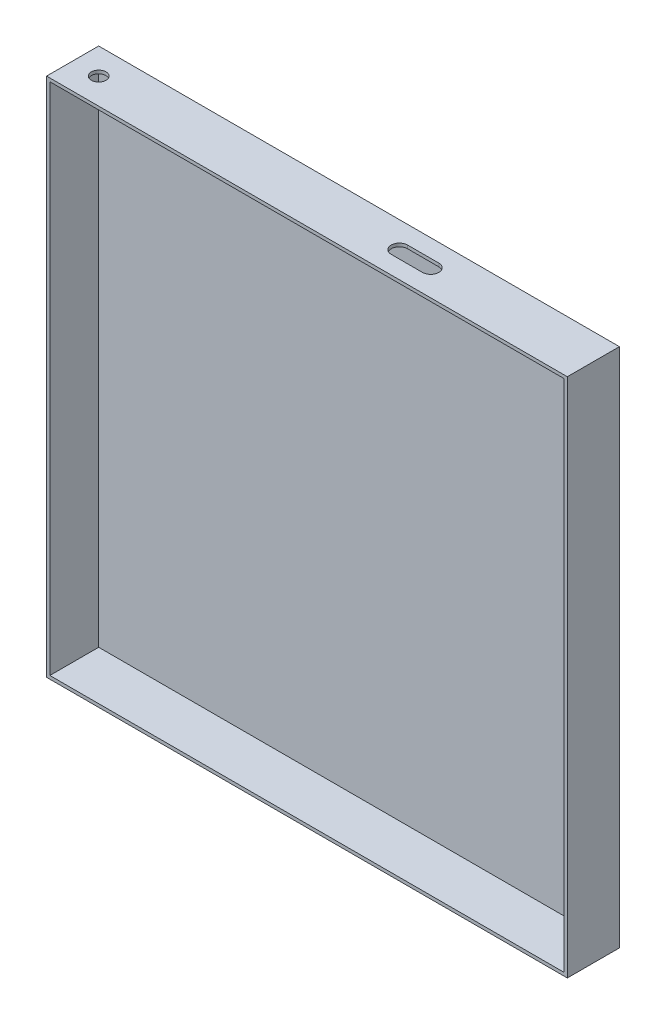
ISO-10303-21;
HEADER;
FILE_DESCRIPTION(('STEP AP214'),'2;1');
FILE_NAME('part.step','',(''),(''),'','','');
FILE_SCHEMA(('AUTOMOTIVE_DESIGN { 1 0 10303 214 1 1 1 1 }'));
ENDSEC;
DATA;
#1=APPLICATION_CONTEXT('core data for automotive mechanical design processes');
#2=APPLICATION_PROTOCOL_DEFINITION('international standard','automotive_design',2000,#1);
#3=PRODUCT_CONTEXT('',#1,'mechanical');
#4=PRODUCT('Part','Part','',(#3));
#5=PRODUCT_RELATED_PRODUCT_CATEGORY('part','',(#4));
#6=PRODUCT_DEFINITION_FORMATION('','',#4);
#7=PRODUCT_DEFINITION_CONTEXT('part definition',#1,'design');
#8=PRODUCT_DEFINITION('design','',#6,#7);
#9=PRODUCT_DEFINITION_SHAPE('','',#8);
#10=(LENGTH_UNIT() NAMED_UNIT(*) SI_UNIT(.MILLI.,.METRE.));
#11=(NAMED_UNIT(*) PLANE_ANGLE_UNIT() SI_UNIT($,.RADIAN.));
#12=(NAMED_UNIT(*) SI_UNIT($,.STERADIAN.) SOLID_ANGLE_UNIT());
#13=UNCERTAINTY_MEASURE_WITH_UNIT(LENGTH_MEASURE(1.E-05),#10,'distance_accuracy_value','');
#14=(GEOMETRIC_REPRESENTATION_CONTEXT(3) GLOBAL_UNCERTAINTY_ASSIGNED_CONTEXT((#13)) GLOBAL_UNIT_ASSIGNED_CONTEXT((#10,
#11,#12)) REPRESENTATION_CONTEXT('',''));
#15=CARTESIAN_POINT('',(0.,0.,0.));
#16=DIRECTION('',(0.,0.,1.));
#17=DIRECTION('',(1.,0.,0.));
#18=AXIS2_PLACEMENT_3D('',#15,#16,#17);
#19=CARTESIAN_POINT('',(0.,0.,50.8));
#20=DIRECTION('',(0.,0.,-1.));
#21=DIRECTION('',(-1.,0.,0.));
#22=AXIS2_PLACEMENT_3D('',#19,#20,#21);
#23=PLANE('',#22);
#24=DIRECTION('',(0.,-1.,0.));
#25=VECTOR('',#24,1.);
#26=CARTESIAN_POINT('',(0.,0.,50.8));
#27=LINE('',#26,#25);
#28=CARTESIAN_POINT('',(0.,508.,50.8));
#29=VERTEX_POINT('',#28);
#30=CARTESIAN_POINT('',(0.,0.,50.8));
#31=VERTEX_POINT('',#30);
#32=EDGE_CURVE('E184',#29,#31,#27,.T.);
#33=ORIENTED_EDGE('',*,*,#32,.T.);
#34=DIRECTION('',(1.,0.,0.));
#35=VECTOR('',#34,1.);
#36=CARTESIAN_POINT('',(0.,0.,50.8));
#37=LINE('',#36,#35);
#38=CARTESIAN_POINT('',(508.,0.,50.8));
#39=VERTEX_POINT('',#38);
#40=EDGE_CURVE('E187',#31,#39,#37,.T.);
#41=ORIENTED_EDGE('',*,*,#40,.T.);
#42=DIRECTION('',(0.,1.,0.));
#43=VECTOR('',#42,1.);
#44=CARTESIAN_POINT('',(508.,0.,50.8));
#45=LINE('',#44,#43);
#46=CARTESIAN_POINT('',(508.,508.,50.8));
#47=VERTEX_POINT('',#46);
#48=EDGE_CURVE('E190',#39,#47,#45,.T.);
#49=ORIENTED_EDGE('',*,*,#48,.T.);
#50=DIRECTION('',(-1.,0.,0.));
#51=VECTOR('',#50,1.);
#52=CARTESIAN_POINT('',(0.,508.,50.8));
#53=LINE('',#52,#51);
#54=EDGE_CURVE('E192',#47,#29,#53,.T.);
#55=ORIENTED_EDGE('',*,*,#54,.T.);
#56=EDGE_LOOP('',(#33,#41,#49,#55));
#57=FACE_BOUND('',#56,.T.);
#58=DIRECTION('',(0.,-1.,0.));
#59=VECTOR('',#58,1.);
#60=CARTESIAN_POINT('',(3.175,0.,50.8));
#61=LINE('',#60,#59);
#62=CARTESIAN_POINT('',(3.175,504.825,50.8));
#63=VERTEX_POINT('',#62);
#64=CARTESIAN_POINT('',(3.175,3.175,50.8));
#65=VERTEX_POINT('',#64);
#66=EDGE_CURVE('E176',#63,#65,#61,.T.);
#67=ORIENTED_EDGE('',*,*,#66,.F.);
#68=DIRECTION('',(-1.,0.,0.));
#69=VECTOR('',#68,1.);
#70=CARTESIAN_POINT('',(0.,504.825,50.8));
#71=LINE('',#70,#69);
#72=CARTESIAN_POINT('',(504.825,504.825,50.8));
#73=VERTEX_POINT('',#72);
#74=EDGE_CURVE('E166',#73,#63,#71,.T.);
#75=ORIENTED_EDGE('',*,*,#74,.F.);
#76=DIRECTION('',(0.,1.,0.));
#77=VECTOR('',#76,1.);
#78=CARTESIAN_POINT('',(504.825,0.,50.8));
#79=LINE('',#78,#77);
#80=CARTESIAN_POINT('',(504.825,3.175,50.8));
#81=VERTEX_POINT('',#80);
#82=EDGE_CURVE('E180',#81,#73,#79,.T.);
#83=ORIENTED_EDGE('',*,*,#82,.F.);
#84=DIRECTION('',(1.,0.,0.));
#85=VECTOR('',#84,1.);
#86=CARTESIAN_POINT('',(0.,3.175,50.8));
#87=LINE('',#86,#85);
#88=EDGE_CURVE('E178',#65,#81,#87,.T.);
#89=ORIENTED_EDGE('',*,*,#88,.F.);
#90=EDGE_LOOP('',(#67,#75,#83,#89));
#91=FACE_BOUND('',#90,.T.);
#92=ADVANCED_FACE('F33',(#57,#91),#23,.F.);
#93=CARTESIAN_POINT('',(0.,0.,50.8));
#94=DIRECTION('',(1.,0.,0.));
#95=DIRECTION('',(0.,0.,-1.));
#96=AXIS2_PLACEMENT_3D('',#93,#94,#95);
#97=PLANE('',#96);
#98=DIRECTION('',(0.,-1.,0.));
#99=VECTOR('',#98,1.);
#100=CARTESIAN_POINT('',(0.,0.,0.));
#101=LINE('',#100,#99);
#102=CARTESIAN_POINT('',(0.,508.,0.));
#103=VERTEX_POINT('',#102);
#104=CARTESIAN_POINT('',(0.,0.,0.));
#105=VERTEX_POINT('',#104);
#106=EDGE_CURVE('E160',#103,#105,#101,.T.);
#107=ORIENTED_EDGE('',*,*,#106,.T.);
#108=DIRECTION('',(0.,0.,-1.));
#109=VECTOR('',#108,1.);
#110=CARTESIAN_POINT('',(0.,0.,50.8));
#111=LINE('',#110,#109);
#112=EDGE_CURVE('E210',#31,#105,#111,.T.);
#113=ORIENTED_EDGE('',*,*,#112,.F.);
#114=ORIENTED_EDGE('',*,*,#32,.F.);
#115=DIRECTION('',(0.,0.,-1.));
#116=VECTOR('',#115,1.);
#117=CARTESIAN_POINT('',(0.,508.,50.8));
#118=LINE('',#117,#116);
#119=EDGE_CURVE('E194',#29,#103,#118,.T.);
#120=ORIENTED_EDGE('',*,*,#119,.T.);
#121=EDGE_LOOP('',(#107,#113,#114,#120));
#122=FACE_BOUND('',#121,.T.);
#123=ADVANCED_FACE('F35',(#122),#97,.F.);
#124=CARTESIAN_POINT('',(0.,0.,50.8));
#125=DIRECTION('',(0.,1.,0.));
#126=DIRECTION('',(0.,0.,1.));
#127=AXIS2_PLACEMENT_3D('',#124,#125,#126);
#128=PLANE('',#127);
#129=DIRECTION('',(1.,0.,0.));
#130=VECTOR('',#129,1.);
#131=CARTESIAN_POINT('',(0.,0.,0.));
#132=LINE('',#131,#130);
#133=CARTESIAN_POINT('',(508.,0.,0.));
#134=VERTEX_POINT('',#133);
#135=EDGE_CURVE('E197',#105,#134,#132,.T.);
#136=ORIENTED_EDGE('',*,*,#135,.T.);
#137=DIRECTION('',(0.,0.,-1.));
#138=VECTOR('',#137,1.);
#139=CARTESIAN_POINT('',(508.,0.,50.8));
#140=LINE('',#139,#138);
#141=EDGE_CURVE('E207',#39,#134,#140,.T.);
#142=ORIENTED_EDGE('',*,*,#141,.F.);
#143=ORIENTED_EDGE('',*,*,#40,.F.);
#144=ORIENTED_EDGE('',*,*,#112,.T.);
#145=EDGE_LOOP('',(#136,#142,#143,#144));
#146=FACE_BOUND('',#145,.T.);
#147=ADVANCED_FACE('F244',(#146),#128,.F.);
#148=CARTESIAN_POINT('',(508.,0.,50.8));
#149=DIRECTION('',(-1.,0.,0.));
#150=DIRECTION('',(0.,0.,1.));
#151=AXIS2_PLACEMENT_3D('',#148,#149,#150);
#152=PLANE('',#151);
#153=DIRECTION('',(0.,1.,0.));
#154=VECTOR('',#153,1.);
#155=CARTESIAN_POINT('',(508.,0.,0.));
#156=LINE('',#155,#154);
#157=CARTESIAN_POINT('',(508.,508.,0.));
#158=VERTEX_POINT('',#157);
#159=EDGE_CURVE('E199',#134,#158,#156,.T.);
#160=ORIENTED_EDGE('',*,*,#159,.T.);
#161=DIRECTION('',(0.,0.,-1.));
#162=VECTOR('',#161,1.);
#163=CARTESIAN_POINT('',(508.,508.,50.8));
#164=LINE('',#163,#162);
#165=EDGE_CURVE('E204',#47,#158,#164,.T.);
#166=ORIENTED_EDGE('',*,*,#165,.F.);
#167=ORIENTED_EDGE('',*,*,#48,.F.);
#168=ORIENTED_EDGE('',*,*,#141,.T.);
#169=EDGE_LOOP('',(#160,#166,#167,#168));
#170=FACE_BOUND('',#169,.T.);
#171=ADVANCED_FACE('F257',(#170),#152,.F.);
#172=CARTESIAN_POINT('',(0.,508.,50.8));
#173=DIRECTION('',(0.,-1.,0.));
#174=DIRECTION('',(0.,0.,-1.));
#175=AXIS2_PLACEMENT_3D('',#172,#173,#174);
#176=PLANE('',#175);
#177=DIRECTION('',(-1.,0.,0.));
#178=VECTOR('',#177,1.);
#179=CARTESIAN_POINT('',(349.25,508.,17.4625));
#180=LINE('',#179,#178);
#181=CARTESIAN_POINT('',(349.25,508.,17.4625));
#182=VERTEX_POINT('',#181);
#183=CARTESIAN_POINT('',(318.77,508.,17.4625));
#184=VERTEX_POINT('',#183);
#185=EDGE_CURVE('E133',#182,#184,#180,.T.);
#186=ORIENTED_EDGE('',*,*,#185,.F.);
#187=CARTESIAN_POINT('',(349.25,508.,25.4));
#188=DIRECTION('',(0.,1.,0.));
#189=DIRECTION('',(0.,0.,1.));
#190=AXIS2_PLACEMENT_3D('',#187,#188,#189);
#191=CIRCLE('',#190,7.93749999999999);
#192=CARTESIAN_POINT('',(349.25,508.,33.3375));
#193=VERTEX_POINT('',#192);
#194=EDGE_CURVE('E48',#193,#182,#191,.T.);
#195=ORIENTED_EDGE('',*,*,#194,.F.);
#196=DIRECTION('',(1.,0.,0.));
#197=VECTOR('',#196,1.);
#198=CARTESIAN_POINT('',(349.25,508.,33.3375));
#199=LINE('',#198,#197);
#200=CARTESIAN_POINT('',(318.77,508.,33.3375));
#201=VERTEX_POINT('',#200);
#202=EDGE_CURVE('E140',#201,#193,#199,.T.);
#203=ORIENTED_EDGE('',*,*,#202,.F.);
#204=CARTESIAN_POINT('',(318.77,508.,25.4));
#205=DIRECTION('',(0.,1.,0.));
#206=DIRECTION('',(0.,0.,1.));
#207=AXIS2_PLACEMENT_3D('',#204,#205,#206);
#208=CIRCLE('',#207,7.9375);
#209=EDGE_CURVE('E124',#184,#201,#208,.T.);
#210=ORIENTED_EDGE('',*,*,#209,.F.);
#211=EDGE_LOOP('',(#186,#195,#203,#210));
#212=FACE_BOUND('',#211,.T.);
#213=CARTESIAN_POINT('',(25.4,508.,25.4));
#214=DIRECTION('',(0.,1.,0.));
#215=DIRECTION('',(0.,0.,1.));
#216=AXIS2_PLACEMENT_3D('',#213,#214,#215);
#217=CIRCLE('',#216,7.14375);
#218=CARTESIAN_POINT('',(25.4,508.,32.54375));
#219=VERTEX_POINT('',#218);
#220=EDGE_CURVE('E147',#219,#219,#217,.T.);
#221=ORIENTED_EDGE('',*,*,#220,.F.);
#222=EDGE_LOOP('',(#221));
#223=FACE_BOUND('',#222,.T.);
#224=DIRECTION('',(-1.,0.,0.));
#225=VECTOR('',#224,1.);
#226=CARTESIAN_POINT('',(0.,508.,0.));
#227=LINE('',#226,#225);
#228=EDGE_CURVE('E188',#158,#103,#227,.T.);
#229=ORIENTED_EDGE('',*,*,#228,.T.);
#230=ORIENTED_EDGE('',*,*,#119,.F.);
#231=ORIENTED_EDGE('',*,*,#54,.F.);
#232=ORIENTED_EDGE('',*,*,#165,.T.);
#233=EDGE_LOOP('',(#229,#230,#231,#232));
#234=FACE_BOUND('',#233,.T.);
#235=ADVANCED_FACE('F137',(#212,#223,#234),#176,.F.);
#236=CARTESIAN_POINT('',(0.,0.,0.));
#237=DIRECTION('',(0.,0.,-1.));
#238=DIRECTION('',(-1.,0.,0.));
#239=AXIS2_PLACEMENT_3D('',#236,#237,#238);
#240=PLANE('',#239);
#241=ORIENTED_EDGE('',*,*,#106,.F.);
#242=ORIENTED_EDGE('',*,*,#228,.F.);
#243=ORIENTED_EDGE('',*,*,#159,.F.);
#244=ORIENTED_EDGE('',*,*,#135,.F.);
#245=EDGE_LOOP('',(#241,#242,#243,#244));
#246=FACE_BOUND('',#245,.T.);
#247=ADVANCED_FACE('F250',(#246),#240,.T.);
#248=CARTESIAN_POINT('',(3.175,0.,50.8));
#249=DIRECTION('',(1.,0.,0.));
#250=DIRECTION('',(0.,0.,-1.));
#251=AXIS2_PLACEMENT_3D('',#248,#249,#250);
#252=PLANE('',#251);
#253=DIRECTION('',(0.,-1.,0.));
#254=VECTOR('',#253,1.);
#255=CARTESIAN_POINT('',(3.175,0.,3.175));
#256=LINE('',#255,#254);
#257=CARTESIAN_POINT('',(3.175,504.825,3.175));
#258=VERTEX_POINT('',#257);
#259=CARTESIAN_POINT('',(3.175,3.175,3.175));
#260=VERTEX_POINT('',#259);
#261=EDGE_CURVE('E153',#258,#260,#256,.T.);
#262=ORIENTED_EDGE('',*,*,#261,.F.);
#263=DIRECTION('',(0.,0.,-1.));
#264=VECTOR('',#263,1.);
#265=CARTESIAN_POINT('',(3.175,504.825,50.8));
#266=LINE('',#265,#264);
#267=EDGE_CURVE('E162',#63,#258,#266,.T.);
#268=ORIENTED_EDGE('',*,*,#267,.F.);
#269=ORIENTED_EDGE('',*,*,#66,.T.);
#270=DIRECTION('',(0.,0.,-1.));
#271=VECTOR('',#270,1.);
#272=CARTESIAN_POINT('',(3.175,3.175,50.8));
#273=LINE('',#272,#271);
#274=EDGE_CURVE('E157',#65,#260,#273,.T.);
#275=ORIENTED_EDGE('',*,*,#274,.T.);
#276=EDGE_LOOP('',(#262,#268,#269,#275));
#277=FACE_BOUND('',#276,.T.);
#278=ADVANCED_FACE('F253',(#277),#252,.T.);
#279=CARTESIAN_POINT('',(0.,3.175,50.8));
#280=DIRECTION('',(0.,1.,0.));
#281=DIRECTION('',(0.,0.,1.));
#282=AXIS2_PLACEMENT_3D('',#279,#280,#281);
#283=PLANE('',#282);
#284=DIRECTION('',(1.,0.,0.));
#285=VECTOR('',#284,1.);
#286=CARTESIAN_POINT('',(0.,3.175,3.175));
#287=LINE('',#286,#285);
#288=CARTESIAN_POINT('',(504.825,3.175,3.175));
#289=VERTEX_POINT('',#288);
#290=EDGE_CURVE('E156',#260,#289,#287,.T.);
#291=ORIENTED_EDGE('',*,*,#290,.F.);
#292=ORIENTED_EDGE('',*,*,#274,.F.);
#293=ORIENTED_EDGE('',*,*,#88,.T.);
#294=DIRECTION('',(0.,0.,-1.));
#295=VECTOR('',#294,1.);
#296=CARTESIAN_POINT('',(504.825,3.175,50.8));
#297=LINE('',#296,#295);
#298=EDGE_CURVE('E161',#81,#289,#297,.T.);
#299=ORIENTED_EDGE('',*,*,#298,.T.);
#300=EDGE_LOOP('',(#291,#292,#293,#299));
#301=FACE_BOUND('',#300,.T.);
#302=ADVANCED_FACE('F297',(#301),#283,.T.);
#303=CARTESIAN_POINT('',(504.825,0.,50.8));
#304=DIRECTION('',(-1.,0.,0.));
#305=DIRECTION('',(0.,0.,1.));
#306=AXIS2_PLACEMENT_3D('',#303,#304,#305);
#307=PLANE('',#306);
#308=DIRECTION('',(0.,1.,0.));
#309=VECTOR('',#308,1.);
#310=CARTESIAN_POINT('',(504.825,0.,3.175));
#311=LINE('',#310,#309);
#312=CARTESIAN_POINT('',(504.825,504.825,3.175));
#313=VERTEX_POINT('',#312);
#314=EDGE_CURVE('E168',#289,#313,#311,.T.);
#315=ORIENTED_EDGE('',*,*,#314,.F.);
#316=ORIENTED_EDGE('',*,*,#298,.F.);
#317=ORIENTED_EDGE('',*,*,#82,.T.);
#318=DIRECTION('',(0.,0.,-1.));
#319=VECTOR('',#318,1.);
#320=CARTESIAN_POINT('',(504.825,504.825,50.8));
#321=LINE('',#320,#319);
#322=EDGE_CURVE('E165',#73,#313,#321,.T.);
#323=ORIENTED_EDGE('',*,*,#322,.T.);
#324=EDGE_LOOP('',(#315,#316,#317,#323));
#325=FACE_BOUND('',#324,.T.);
#326=ADVANCED_FACE('F305',(#325),#307,.T.);
#327=CARTESIAN_POINT('',(0.,504.825,50.8));
#328=DIRECTION('',(0.,-1.,0.));
#329=DIRECTION('',(0.,0.,-1.));
#330=AXIS2_PLACEMENT_3D('',#327,#328,#329);
#331=PLANE('',#330);
#332=CARTESIAN_POINT('',(349.25,504.825,25.4));
#333=DIRECTION('',(0.,-1.,0.));
#334=DIRECTION('',(0.,0.,-1.));
#335=AXIS2_PLACEMENT_3D('',#332,#333,#334);
#336=CIRCLE('',#335,7.93749999999999);
#337=CARTESIAN_POINT('',(349.25,504.825,17.4625));
#338=VERTEX_POINT('',#337);
#339=CARTESIAN_POINT('',(349.25,504.825,33.3375));
#340=VERTEX_POINT('',#339);
#341=EDGE_CURVE('E11',#338,#340,#336,.T.);
#342=ORIENTED_EDGE('',*,*,#341,.F.);
#343=DIRECTION('',(1.,0.,0.));
#344=VECTOR('',#343,1.);
#345=CARTESIAN_POINT('',(0.,504.825,17.4624999999999));
#346=LINE('',#345,#344);
#347=CARTESIAN_POINT('',(318.77,504.825,17.4625));
#348=VERTEX_POINT('',#347);
#349=EDGE_CURVE('E213',#348,#338,#346,.T.);
#350=ORIENTED_EDGE('',*,*,#349,.F.);
#351=CARTESIAN_POINT('',(318.77,504.825,25.4));
#352=DIRECTION('',(0.,-1.,0.));
#353=DIRECTION('',(0.,0.,-1.));
#354=AXIS2_PLACEMENT_3D('',#351,#352,#353);
#355=CIRCLE('',#354,7.9375);
#356=CARTESIAN_POINT('',(318.77,504.825,33.3375));
#357=VERTEX_POINT('',#356);
#358=EDGE_CURVE('E127',#357,#348,#355,.T.);
#359=ORIENTED_EDGE('',*,*,#358,.F.);
#360=DIRECTION('',(-1.,0.,0.));
#361=VECTOR('',#360,1.);
#362=CARTESIAN_POINT('',(0.,504.825,33.3375000000002));
#363=LINE('',#362,#361);
#364=EDGE_CURVE('E41',#340,#357,#363,.T.);
#365=ORIENTED_EDGE('',*,*,#364,.F.);
#366=EDGE_LOOP('',(#342,#350,#359,#365));
#367=FACE_BOUND('',#366,.T.);
#368=CARTESIAN_POINT('',(25.4,504.825,25.4));
#369=DIRECTION('',(0.,-1.,0.));
#370=DIRECTION('',(0.,0.,-1.));
#371=AXIS2_PLACEMENT_3D('',#368,#369,#370);
#372=CIRCLE('',#371,7.14375);
#373=CARTESIAN_POINT('',(25.4,504.825,18.25625));
#374=VERTEX_POINT('',#373);
#375=EDGE_CURVE('E152',#374,#374,#372,.T.);
#376=ORIENTED_EDGE('',*,*,#375,.F.);
#377=EDGE_LOOP('',(#376));
#378=FACE_BOUND('',#377,.T.);
#379=DIRECTION('',(-1.,0.,0.));
#380=VECTOR('',#379,1.);
#381=CARTESIAN_POINT('',(0.,504.825,3.175));
#382=LINE('',#381,#380);
#383=EDGE_CURVE('E172',#313,#258,#382,.T.);
#384=ORIENTED_EDGE('',*,*,#383,.F.);
#385=ORIENTED_EDGE('',*,*,#322,.F.);
#386=ORIENTED_EDGE('',*,*,#74,.T.);
#387=ORIENTED_EDGE('',*,*,#267,.T.);
#388=EDGE_LOOP('',(#384,#385,#386,#387));
#389=FACE_BOUND('',#388,.T.);
#390=ADVANCED_FACE('F223',(#367,#378,#389),#331,.T.);
#391=CARTESIAN_POINT('',(0.,0.,3.175));
#392=DIRECTION('',(0.,0.,-1.));
#393=DIRECTION('',(-1.,0.,0.));
#394=AXIS2_PLACEMENT_3D('',#391,#392,#393);
#395=PLANE('',#394);
#396=ORIENTED_EDGE('',*,*,#261,.T.);
#397=ORIENTED_EDGE('',*,*,#290,.T.);
#398=ORIENTED_EDGE('',*,*,#314,.T.);
#399=ORIENTED_EDGE('',*,*,#383,.T.);
#400=EDGE_LOOP('',(#396,#397,#398,#399));
#401=FACE_BOUND('',#400,.T.);
#402=ADVANCED_FACE('F234',(#401),#395,.F.);
#403=CARTESIAN_POINT('',(25.4,90.424,25.4));
#404=DIRECTION('',(0.,1.,0.));
#405=DIRECTION('',(0.,0.,1.));
#406=AXIS2_PLACEMENT_3D('',#403,#404,#405);
#407=CYLINDRICAL_SURFACE('',#406,7.14375);
#408=ORIENTED_EDGE('',*,*,#375,.T.);
#409=EDGE_LOOP('',(#408));
#410=FACE_BOUND('',#409,.T.);
#411=ORIENTED_EDGE('',*,*,#220,.T.);
#412=EDGE_LOOP('',(#411));
#413=FACE_BOUND('',#412,.T.);
#414=ADVANCED_FACE('F227',(#410,#413),#407,.F.);
#415=CARTESIAN_POINT('',(349.25,90.424,25.4));
#416=DIRECTION('',(0.,1.,0.));
#417=DIRECTION('',(0.,0.,1.));
#418=AXIS2_PLACEMENT_3D('',#415,#416,#417);
#419=CYLINDRICAL_SURFACE('',#418,7.93749999999999);
#420=ORIENTED_EDGE('',*,*,#341,.T.);
#421=DIRECTION('',(0.,1.,0.));
#422=VECTOR('',#421,1.);
#423=CARTESIAN_POINT('',(349.25,90.424,33.3375));
#424=LINE('',#423,#422);
#425=EDGE_CURVE('E145',#340,#193,#424,.T.);
#426=ORIENTED_EDGE('',*,*,#425,.T.);
#427=ORIENTED_EDGE('',*,*,#194,.T.);
#428=DIRECTION('',(0.,1.,0.));
#429=VECTOR('',#428,1.);
#430=CARTESIAN_POINT('',(349.25,90.424,17.4625));
#431=LINE('',#430,#429);
#432=EDGE_CURVE('E130',#338,#182,#431,.T.);
#433=ORIENTED_EDGE('',*,*,#432,.F.);
#434=EDGE_LOOP('',(#420,#426,#427,#433));
#435=FACE_BOUND('',#434,.T.);
#436=ADVANCED_FACE('F225',(#435),#419,.F.);
#437=CARTESIAN_POINT('',(349.25,90.424,33.3375));
#438=DIRECTION('',(0.,0.,1.));
#439=DIRECTION('',(1.,0.,0.));
#440=AXIS2_PLACEMENT_3D('',#437,#438,#439);
#441=PLANE('',#440);
#442=ORIENTED_EDGE('',*,*,#364,.T.);
#443=DIRECTION('',(0.,1.,0.));
#444=VECTOR('',#443,1.);
#445=CARTESIAN_POINT('',(318.77,90.424,33.3375));
#446=LINE('',#445,#444);
#447=EDGE_CURVE('E129',#357,#201,#446,.T.);
#448=ORIENTED_EDGE('',*,*,#447,.T.);
#449=ORIENTED_EDGE('',*,*,#202,.T.);
#450=ORIENTED_EDGE('',*,*,#425,.F.);
#451=EDGE_LOOP('',(#442,#448,#449,#450));
#452=FACE_BOUND('',#451,.T.);
#453=ADVANCED_FACE('F220',(#452),#441,.F.);
#454=CARTESIAN_POINT('',(318.77,90.424,25.4));
#455=DIRECTION('',(0.,1.,0.));
#456=DIRECTION('',(0.,0.,1.));
#457=AXIS2_PLACEMENT_3D('',#454,#455,#456);
#458=CYLINDRICAL_SURFACE('',#457,7.9375);
#459=ORIENTED_EDGE('',*,*,#358,.T.);
#460=DIRECTION('',(0.,1.,0.));
#461=VECTOR('',#460,1.);
#462=CARTESIAN_POINT('',(318.77,90.424,17.4625));
#463=LINE('',#462,#461);
#464=EDGE_CURVE('E56',#348,#184,#463,.T.);
#465=ORIENTED_EDGE('',*,*,#464,.T.);
#466=ORIENTED_EDGE('',*,*,#209,.T.);
#467=ORIENTED_EDGE('',*,*,#447,.F.);
#468=EDGE_LOOP('',(#459,#465,#466,#467));
#469=FACE_BOUND('',#468,.T.);
#470=ADVANCED_FACE('F121',(#469),#458,.F.);
#471=CARTESIAN_POINT('',(349.25,90.424,17.4625));
#472=DIRECTION('',(0.,0.,-1.));
#473=DIRECTION('',(-1.,0.,0.));
#474=AXIS2_PLACEMENT_3D('',#471,#472,#473);
#475=PLANE('',#474);
#476=ORIENTED_EDGE('',*,*,#349,.T.);
#477=ORIENTED_EDGE('',*,*,#432,.T.);
#478=ORIENTED_EDGE('',*,*,#185,.T.);
#479=ORIENTED_EDGE('',*,*,#464,.F.);
#480=EDGE_LOOP('',(#476,#477,#478,#479));
#481=FACE_BOUND('',#480,.T.);
#482=ADVANCED_FACE('F134',(#481),#475,.F.);
#483=CLOSED_SHELL('',(#92,#123,#147,#171,#235,#247,#278,#302,#326,#390,#402,#414,#436,#453,#470,#482));
#484=MANIFOLD_SOLID_BREP('B2',#483);
#485=ADVANCED_BREP_SHAPE_REPRESENTATION('',(#18,#484),#14);
#486=SHAPE_DEFINITION_REPRESENTATION(#9,#485);
ENDSEC;
END-ISO-10303-21;
